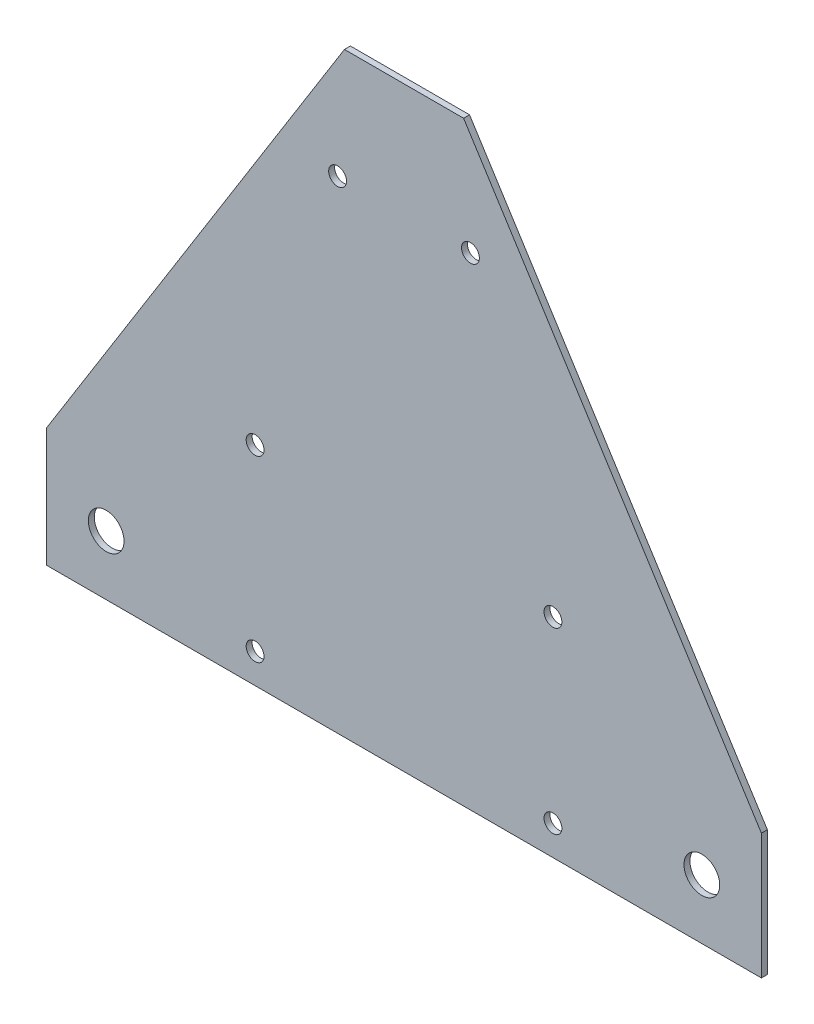
ISO-10303-21;
HEADER;
FILE_DESCRIPTION(('STEP AP214'),'2;1');
FILE_NAME('part.step','',(''),(''),'','','');
FILE_SCHEMA(('AUTOMOTIVE_DESIGN { 1 0 10303 214 1 1 1 1 }'));
ENDSEC;
DATA;
#1=APPLICATION_CONTEXT('core data for automotive mechanical design processes');
#2=APPLICATION_PROTOCOL_DEFINITION('international standard','automotive_design',2000,#1);
#3=PRODUCT_CONTEXT('',#1,'mechanical');
#4=PRODUCT('Part','Part','',(#3));
#5=PRODUCT_RELATED_PRODUCT_CATEGORY('part','',(#4));
#6=PRODUCT_DEFINITION_FORMATION('','',#4);
#7=PRODUCT_DEFINITION_CONTEXT('part definition',#1,'design');
#8=PRODUCT_DEFINITION('design','',#6,#7);
#9=PRODUCT_DEFINITION_SHAPE('','',#8);
#10=(LENGTH_UNIT() NAMED_UNIT(*) SI_UNIT(.MILLI.,.METRE.));
#11=(NAMED_UNIT(*) PLANE_ANGLE_UNIT() SI_UNIT($,.RADIAN.));
#12=(NAMED_UNIT(*) SI_UNIT($,.STERADIAN.) SOLID_ANGLE_UNIT());
#13=UNCERTAINTY_MEASURE_WITH_UNIT(LENGTH_MEASURE(1.E-05),#10,'distance_accuracy_value','');
#14=(GEOMETRIC_REPRESENTATION_CONTEXT(3) GLOBAL_UNCERTAINTY_ASSIGNED_CONTEXT((#13)) GLOBAL_UNIT_ASSIGNED_CONTEXT((#10,
#11,#12)) REPRESENTATION_CONTEXT('',''));
#15=CARTESIAN_POINT('',(0.,0.,0.));
#16=DIRECTION('',(0.,0.,1.));
#17=DIRECTION('',(1.,0.,0.));
#18=AXIS2_PLACEMENT_3D('',#15,#16,#17);
#19=CARTESIAN_POINT('',(29.7876692210684,18.86552384001,1.));
#20=DIRECTION('',(0.844819075554228,0.535052081184345,0.));
#21=DIRECTION('',(-0.535052081184345,0.844819075554228,0.));
#22=AXIS2_PLACEMENT_3D('',#19,#20,#21);
#23=PLANE('',#22);
#24=DIRECTION('',(0.535052081184345,-0.844819075554228,0.));
#25=VECTOR('',#24,1.);
#26=CARTESIAN_POINT('',(29.7876692210684,18.86552384001,0.));
#27=LINE('',#26,#25);
#28=CARTESIAN_POINT('',(10.,50.1092120838022,0.));
#29=VERTEX_POINT('',#28);
#30=CARTESIAN_POINT('',(60.,-28.8381563372504,0.));
#31=VERTEX_POINT('',#30);
#32=EDGE_CURVE('E160',#29,#31,#27,.T.);
#33=ORIENTED_EDGE('',*,*,#32,.F.);
#34=DIRECTION('',(0.,0.,-1.));
#35=VECTOR('',#34,1.);
#36=CARTESIAN_POINT('',(10.,50.1092120838022,1.));
#37=LINE('',#36,#35);
#38=CARTESIAN_POINT('',(10.,50.1092120838022,1.));
#39=VERTEX_POINT('',#38);
#40=EDGE_CURVE('E11',#39,#29,#37,.T.);
#41=ORIENTED_EDGE('',*,*,#40,.F.);
#42=DIRECTION('',(0.535052081184345,-0.844819075554228,0.));
#43=VECTOR('',#42,1.);
#44=CARTESIAN_POINT('',(29.7876692210684,18.86552384001,1.));
#45=LINE('',#44,#43);
#46=CARTESIAN_POINT('',(60.,-28.8381563372504,1.));
#47=VERTEX_POINT('',#46);
#48=EDGE_CURVE('E148',#39,#47,#45,.T.);
#49=ORIENTED_EDGE('',*,*,#48,.T.);
#50=DIRECTION('',(0.,0.,-1.));
#51=VECTOR('',#50,1.);
#52=CARTESIAN_POINT('',(60.,-28.8381563372504,1.));
#53=LINE('',#52,#51);
#54=EDGE_CURVE('E56',#47,#31,#53,.T.);
#55=ORIENTED_EDGE('',*,*,#54,.T.);
#56=EDGE_LOOP('',(#33,#41,#49,#55));
#57=FACE_BOUND('',#56,.T.);
#58=ADVANCED_FACE('F37',(#57),#23,.T.);
#59=CARTESIAN_POINT('',(0.,50.1092120838022,1.));
#60=DIRECTION('',(0.,1.,0.));
#61=DIRECTION('',(-1.,0.,0.));
#62=AXIS2_PLACEMENT_3D('',#59,#60,#61);
#63=PLANE('',#62);
#64=DIRECTION('',(1.,0.,0.));
#65=VECTOR('',#64,1.);
#66=CARTESIAN_POINT('',(0.,50.1092120838022,0.));
#67=LINE('',#66,#65);
#68=CARTESIAN_POINT('',(-10.,50.1092120838022,0.));
#69=VERTEX_POINT('',#68);
#70=EDGE_CURVE('E162',#69,#29,#67,.T.);
#71=ORIENTED_EDGE('',*,*,#70,.F.);
#72=DIRECTION('',(0.,0.,-1.));
#73=VECTOR('',#72,1.);
#74=CARTESIAN_POINT('',(-10.,50.1092120838022,1.));
#75=LINE('',#74,#73);
#76=CARTESIAN_POINT('',(-10.,50.1092120838022,1.));
#77=VERTEX_POINT('',#76);
#78=EDGE_CURVE('E47',#77,#69,#75,.T.);
#79=ORIENTED_EDGE('',*,*,#78,.F.);
#80=DIRECTION('',(1.,0.,0.));
#81=VECTOR('',#80,1.);
#82=CARTESIAN_POINT('',(0.,50.1092120838022,1.));
#83=LINE('',#82,#81);
#84=EDGE_CURVE('E150',#77,#39,#83,.T.);
#85=ORIENTED_EDGE('',*,*,#84,.T.);
#86=ORIENTED_EDGE('',*,*,#40,.T.);
#87=EDGE_LOOP('',(#71,#79,#85,#86));
#88=FACE_BOUND('',#87,.T.);
#89=ADVANCED_FACE('F188',(#88),#63,.T.);
#90=CARTESIAN_POINT('',(-29.7120054309224,18.5700033943265,1.));
#91=DIRECTION('',(0.847998304005088,-0.52999894000318,0.));
#92=DIRECTION('',(0.52999894000318,0.847998304005088,0.));
#93=AXIS2_PLACEMENT_3D('',#90,#91,#92);
#94=PLANE('',#93);
#95=DIRECTION('',(-0.52999894000318,-0.847998304005088,0.));
#96=VECTOR('',#95,1.);
#97=CARTESIAN_POINT('',(-29.7120054309224,18.5700033943265,0.));
#98=LINE('',#97,#96);
#99=CARTESIAN_POINT('',(-60.,-29.8907879161978,0.));
#100=VERTEX_POINT('',#99);
#101=EDGE_CURVE('E165',#69,#100,#98,.T.);
#102=ORIENTED_EDGE('',*,*,#101,.T.);
#103=DIRECTION('',(0.,0.,-1.));
#104=VECTOR('',#103,1.);
#105=CARTESIAN_POINT('',(-60.,-29.8907879161978,1.));
#106=LINE('',#105,#104);
#107=CARTESIAN_POINT('',(-60.,-29.8907879161978,1.));
#108=VERTEX_POINT('',#107);
#109=EDGE_CURVE('E116',#108,#100,#106,.T.);
#110=ORIENTED_EDGE('',*,*,#109,.F.);
#111=DIRECTION('',(-0.52999894000318,-0.847998304005088,0.));
#112=VECTOR('',#111,1.);
#113=CARTESIAN_POINT('',(-29.7120054309224,18.5700033943265,1.));
#114=LINE('',#113,#112);
#115=EDGE_CURVE('E109',#77,#108,#114,.T.);
#116=ORIENTED_EDGE('',*,*,#115,.F.);
#117=ORIENTED_EDGE('',*,*,#78,.T.);
#118=EDGE_LOOP('',(#102,#110,#116,#117));
#119=FACE_BOUND('',#118,.T.);
#120=ADVANCED_FACE('F193',(#119),#94,.F.);
#121=CARTESIAN_POINT('',(-60.,0.,1.));
#122=DIRECTION('',(1.,0.,0.));
#123=DIRECTION('',(0.,0.,-1.));
#124=AXIS2_PLACEMENT_3D('',#121,#122,#123);
#125=PLANE('',#124);
#126=DIRECTION('',(0.,-1.,0.));
#127=VECTOR('',#126,1.);
#128=CARTESIAN_POINT('',(-60.,0.,0.));
#129=LINE('',#128,#127);
#130=CARTESIAN_POINT('',(-60.,-49.8907879161978,0.));
#131=VERTEX_POINT('',#130);
#132=EDGE_CURVE('E115',#100,#131,#129,.T.);
#133=ORIENTED_EDGE('',*,*,#132,.T.);
#134=DIRECTION('',(0.,0.,-1.));
#135=VECTOR('',#134,1.);
#136=CARTESIAN_POINT('',(-60.,-49.8907879161978,1.));
#137=LINE('',#136,#135);
#138=CARTESIAN_POINT('',(-60.,-49.8907879161978,1.));
#139=VERTEX_POINT('',#138);
#140=EDGE_CURVE('E98',#139,#131,#137,.T.);
#141=ORIENTED_EDGE('',*,*,#140,.F.);
#142=DIRECTION('',(0.,-1.,0.));
#143=VECTOR('',#142,1.);
#144=CARTESIAN_POINT('',(-60.,0.,1.));
#145=LINE('',#144,#143);
#146=EDGE_CURVE('E103',#108,#139,#145,.T.);
#147=ORIENTED_EDGE('',*,*,#146,.F.);
#148=ORIENTED_EDGE('',*,*,#109,.T.);
#149=EDGE_LOOP('',(#133,#141,#147,#148));
#150=FACE_BOUND('',#149,.T.);
#151=ADVANCED_FACE('F114',(#150),#125,.F.);
#152=CARTESIAN_POINT('',(0.,-49.8907879161978,1.));
#153=DIRECTION('',(0.,1.,0.));
#154=DIRECTION('',(0.,0.,1.));
#155=AXIS2_PLACEMENT_3D('',#152,#153,#154);
#156=PLANE('',#155);
#157=DIRECTION('',(1.,0.,0.));
#158=VECTOR('',#157,1.);
#159=CARTESIAN_POINT('',(0.,-49.8907879161978,0.));
#160=LINE('',#159,#158);
#161=CARTESIAN_POINT('',(60.,-49.8907879161978,0.));
#162=VERTEX_POINT('',#161);
#163=EDGE_CURVE('E169',#131,#162,#160,.T.);
#164=ORIENTED_EDGE('',*,*,#163,.T.);
#165=DIRECTION('',(0.,0.,-1.));
#166=VECTOR('',#165,1.);
#167=CARTESIAN_POINT('',(60.,-49.8907879161978,1.));
#168=LINE('',#167,#166);
#169=CARTESIAN_POINT('',(60.,-49.8907879161978,1.));
#170=VERTEX_POINT('',#169);
#171=EDGE_CURVE('E76',#170,#162,#168,.T.);
#172=ORIENTED_EDGE('',*,*,#171,.F.);
#173=DIRECTION('',(1.,0.,0.));
#174=VECTOR('',#173,1.);
#175=CARTESIAN_POINT('',(0.,-49.8907879161978,1.));
#176=LINE('',#175,#174);
#177=EDGE_CURVE('E94',#139,#170,#176,.T.);
#178=ORIENTED_EDGE('',*,*,#177,.F.);
#179=ORIENTED_EDGE('',*,*,#140,.T.);
#180=EDGE_LOOP('',(#164,#172,#178,#179));
#181=FACE_BOUND('',#180,.T.);
#182=ADVANCED_FACE('F96',(#181),#156,.F.);
#183=CARTESIAN_POINT('',(-50.,-39.8907879161978,1.));
#184=DIRECTION('',(0.,0.,-1.));
#185=DIRECTION('',(-1.,0.,0.));
#186=AXIS2_PLACEMENT_3D('',#183,#184,#185);
#187=CYLINDRICAL_SURFACE('',#186,3.);
#188=CARTESIAN_POINT('',(-50.,-39.8907879161978,1.));
#189=DIRECTION('',(0.,0.,1.));
#190=DIRECTION('',(1.,0.,0.));
#191=AXIS2_PLACEMENT_3D('',#188,#189,#190);
#192=CIRCLE('',#191,3.);
#193=CARTESIAN_POINT('',(-47.,-39.8907879161978,1.));
#194=VERTEX_POINT('',#193);
#195=EDGE_CURVE('E144',#194,#194,#192,.T.);
#196=ORIENTED_EDGE('',*,*,#195,.T.);
#197=EDGE_LOOP('',(#196));
#198=FACE_BOUND('',#197,.T.);
#199=CARTESIAN_POINT('',(-50.,-39.8907879161978,0.));
#200=DIRECTION('',(0.,0.,1.));
#201=DIRECTION('',(1.,0.,0.));
#202=AXIS2_PLACEMENT_3D('',#199,#200,#201);
#203=CIRCLE('',#202,3.);
#204=CARTESIAN_POINT('',(-47.,-39.8907879161978,0.));
#205=VERTEX_POINT('',#204);
#206=EDGE_CURVE('E157',#205,#205,#203,.T.);
#207=ORIENTED_EDGE('',*,*,#206,.F.);
#208=EDGE_LOOP('',(#207));
#209=FACE_BOUND('',#208,.T.);
#210=ADVANCED_FACE('F183',(#198,#209),#187,.F.);
#211=CARTESIAN_POINT('',(50.,-39.8907879161978,1.));
#212=DIRECTION('',(0.,0.,-1.));
#213=DIRECTION('',(-1.,0.,0.));
#214=AXIS2_PLACEMENT_3D('',#211,#212,#213);
#215=CYLINDRICAL_SURFACE('',#214,3.);
#216=CARTESIAN_POINT('',(50.,-39.8907879161978,1.));
#217=DIRECTION('',(0.,0.,1.));
#218=DIRECTION('',(1.,0.,0.));
#219=AXIS2_PLACEMENT_3D('',#216,#217,#218);
#220=CIRCLE('',#219,3.);
#221=CARTESIAN_POINT('',(53.,-39.8907879161978,1.));
#222=VERTEX_POINT('',#221);
#223=EDGE_CURVE('E141',#222,#222,#220,.T.);
#224=ORIENTED_EDGE('',*,*,#223,.T.);
#225=EDGE_LOOP('',(#224));
#226=FACE_BOUND('',#225,.T.);
#227=CARTESIAN_POINT('',(50.,-39.8907879161978,0.));
#228=DIRECTION('',(0.,0.,1.));
#229=DIRECTION('',(1.,0.,0.));
#230=AXIS2_PLACEMENT_3D('',#227,#228,#229);
#231=CIRCLE('',#230,3.);
#232=CARTESIAN_POINT('',(53.,-39.8907879161978,0.));
#233=VERTEX_POINT('',#232);
#234=EDGE_CURVE('E128',#233,#233,#231,.T.);
#235=ORIENTED_EDGE('',*,*,#234,.F.);
#236=EDGE_LOOP('',(#235));
#237=FACE_BOUND('',#236,.T.);
#238=ADVANCED_FACE('F39',(#226,#237),#215,.F.);
#239=CARTESIAN_POINT('',(60.,0.,1.));
#240=DIRECTION('',(1.,0.,0.));
#241=DIRECTION('',(0.,1.,0.));
#242=AXIS2_PLACEMENT_3D('',#239,#240,#241);
#243=PLANE('',#242);
#244=DIRECTION('',(0.,-1.,0.));
#245=VECTOR('',#244,1.);
#246=CARTESIAN_POINT('',(60.,0.,0.));
#247=LINE('',#246,#245);
#248=EDGE_CURVE('E145',#31,#162,#247,.T.);
#249=ORIENTED_EDGE('',*,*,#248,.F.);
#250=ORIENTED_EDGE('',*,*,#54,.F.);
#251=DIRECTION('',(0.,-1.,0.));
#252=VECTOR('',#251,1.);
#253=CARTESIAN_POINT('',(60.,0.,1.));
#254=LINE('',#253,#252);
#255=EDGE_CURVE('E102',#47,#170,#254,.T.);
#256=ORIENTED_EDGE('',*,*,#255,.T.);
#257=ORIENTED_EDGE('',*,*,#171,.T.);
#258=EDGE_LOOP('',(#249,#250,#256,#257));
#259=FACE_BOUND('',#258,.T.);
#260=ADVANCED_FACE('F174',(#259),#243,.T.);
#261=CARTESIAN_POINT('',(0.,0.,1.));
#262=DIRECTION('',(0.,0.,1.));
#263=DIRECTION('',(1.,0.,0.));
#264=AXIS2_PLACEMENT_3D('',#261,#262,#263);
#265=PLANE('',#264);
#266=CARTESIAN_POINT('',(-25.,-14.8907879161978,1.));
#267=DIRECTION('',(0.,0.,1.));
#268=DIRECTION('',(-1.,0.,0.));
#269=AXIS2_PLACEMENT_3D('',#266,#267,#268);
#270=CIRCLE('',#269,1.50000000000001);
#271=CARTESIAN_POINT('',(-26.5,-14.8907879161978,1.));
#272=VERTEX_POINT('',#271);
#273=EDGE_CURVE('E256',#272,#272,#270,.T.);
#274=ORIENTED_EDGE('',*,*,#273,.F.);
#275=EDGE_LOOP('',(#274));
#276=FACE_BOUND('',#275,.T.);
#277=CARTESIAN_POINT('',(-25.,-44.8907879161978,1.));
#278=DIRECTION('',(0.,0.,1.));
#279=DIRECTION('',(-1.,0.,0.));
#280=AXIS2_PLACEMENT_3D('',#277,#278,#279);
#281=CIRCLE('',#280,1.50000000000001);
#282=CARTESIAN_POINT('',(-26.5,-44.8907879161978,1.));
#283=VERTEX_POINT('',#282);
#284=EDGE_CURVE('E249',#283,#283,#281,.T.);
#285=ORIENTED_EDGE('',*,*,#284,.F.);
#286=EDGE_LOOP('',(#285));
#287=FACE_BOUND('',#286,.T.);
#288=CARTESIAN_POINT('',(25.,-44.8907879161978,1.));
#289=DIRECTION('',(0.,0.,1.));
#290=DIRECTION('',(1.,0.,0.));
#291=AXIS2_PLACEMENT_3D('',#288,#289,#290);
#292=CIRCLE('',#291,1.5);
#293=CARTESIAN_POINT('',(26.5,-44.8907879161978,1.));
#294=VERTEX_POINT('',#293);
#295=EDGE_CURVE('E243',#294,#294,#292,.T.);
#296=ORIENTED_EDGE('',*,*,#295,.F.);
#297=EDGE_LOOP('',(#296));
#298=FACE_BOUND('',#297,.T.);
#299=CARTESIAN_POINT('',(25.,-14.8907879161978,1.));
#300=DIRECTION('',(0.,0.,1.));
#301=DIRECTION('',(1.,0.,0.));
#302=AXIS2_PLACEMENT_3D('',#299,#300,#301);
#303=CIRCLE('',#302,1.5);
#304=CARTESIAN_POINT('',(26.5,-14.8907879161978,1.));
#305=VERTEX_POINT('',#304);
#306=EDGE_CURVE('E138',#305,#305,#303,.T.);
#307=ORIENTED_EDGE('',*,*,#306,.F.);
#308=EDGE_LOOP('',(#307));
#309=FACE_BOUND('',#308,.T.);
#310=CARTESIAN_POINT('',(-11.15,31.1092120838022,1.));
#311=DIRECTION('',(0.,0.,1.));
#312=DIRECTION('',(1.,0.,0.));
#313=AXIS2_PLACEMENT_3D('',#310,#311,#312);
#314=CIRCLE('',#313,1.5);
#315=CARTESIAN_POINT('',(-9.65,31.1092120838022,1.));
#316=VERTEX_POINT('',#315);
#317=EDGE_CURVE('E124',#316,#316,#314,.T.);
#318=ORIENTED_EDGE('',*,*,#317,.F.);
#319=EDGE_LOOP('',(#318));
#320=FACE_BOUND('',#319,.T.);
#321=CARTESIAN_POINT('',(11.15,31.1092120838022,1.));
#322=DIRECTION('',(0.,0.,1.));
#323=DIRECTION('',(1.,0.,0.));
#324=AXIS2_PLACEMENT_3D('',#321,#322,#323);
#325=CIRCLE('',#324,1.5);
#326=CARTESIAN_POINT('',(12.65,31.1092120838022,1.));
#327=VERTEX_POINT('',#326);
#328=EDGE_CURVE('E130',#327,#327,#325,.T.);
#329=ORIENTED_EDGE('',*,*,#328,.F.);
#330=EDGE_LOOP('',(#329));
#331=FACE_BOUND('',#330,.T.);
#332=ORIENTED_EDGE('',*,*,#223,.F.);
#333=EDGE_LOOP('',(#332));
#334=FACE_BOUND('',#333,.T.);
#335=ORIENTED_EDGE('',*,*,#195,.F.);
#336=EDGE_LOOP('',(#335));
#337=FACE_BOUND('',#336,.T.);
#338=ORIENTED_EDGE('',*,*,#48,.F.);
#339=ORIENTED_EDGE('',*,*,#84,.F.);
#340=ORIENTED_EDGE('',*,*,#115,.T.);
#341=ORIENTED_EDGE('',*,*,#146,.T.);
#342=ORIENTED_EDGE('',*,*,#177,.T.);
#343=ORIENTED_EDGE('',*,*,#255,.F.);
#344=EDGE_LOOP('',(#338,#339,#340,#341,#342,#343));
#345=FACE_BOUND('',#344,.T.);
#346=ADVANCED_FACE('F106',(#276,#287,#298,#309,#320,#331,#334,#337,#345),#265,.T.);
#347=CARTESIAN_POINT('',(0.,0.,0.));
#348=DIRECTION('',(0.,0.,1.));
#349=DIRECTION('',(1.,0.,0.));
#350=AXIS2_PLACEMENT_3D('',#347,#348,#349);
#351=PLANE('',#350);
#352=CARTESIAN_POINT('',(-25.,-14.8907879161978,0.));
#353=DIRECTION('',(0.,0.,1.));
#354=DIRECTION('',(-1.,0.,0.));
#355=AXIS2_PLACEMENT_3D('',#352,#353,#354);
#356=CIRCLE('',#355,1.50000000000001);
#357=CARTESIAN_POINT('',(-26.5,-14.8907879161978,0.));
#358=VERTEX_POINT('',#357);
#359=EDGE_CURVE('E254',#358,#358,#356,.T.);
#360=ORIENTED_EDGE('',*,*,#359,.T.);
#361=EDGE_LOOP('',(#360));
#362=FACE_BOUND('',#361,.T.);
#363=CARTESIAN_POINT('',(-25.,-44.8907879161978,0.));
#364=DIRECTION('',(0.,0.,1.));
#365=DIRECTION('',(-1.,0.,0.));
#366=AXIS2_PLACEMENT_3D('',#363,#364,#365);
#367=CIRCLE('',#366,1.50000000000001);
#368=CARTESIAN_POINT('',(-26.5,-44.8907879161978,0.));
#369=VERTEX_POINT('',#368);
#370=EDGE_CURVE('E245',#369,#369,#367,.T.);
#371=ORIENTED_EDGE('',*,*,#370,.T.);
#372=EDGE_LOOP('',(#371));
#373=FACE_BOUND('',#372,.T.);
#374=CARTESIAN_POINT('',(25.,-44.8907879161978,0.));
#375=DIRECTION('',(0.,0.,1.));
#376=DIRECTION('',(1.,0.,0.));
#377=AXIS2_PLACEMENT_3D('',#374,#375,#376);
#378=CIRCLE('',#377,1.5);
#379=CARTESIAN_POINT('',(26.5,-44.8907879161978,0.));
#380=VERTEX_POINT('',#379);
#381=EDGE_CURVE('E240',#380,#380,#378,.T.);
#382=ORIENTED_EDGE('',*,*,#381,.T.);
#383=EDGE_LOOP('',(#382));
#384=FACE_BOUND('',#383,.T.);
#385=CARTESIAN_POINT('',(25.,-14.8907879161978,0.));
#386=DIRECTION('',(0.,0.,1.));
#387=DIRECTION('',(1.,0.,0.));
#388=AXIS2_PLACEMENT_3D('',#385,#386,#387);
#389=CIRCLE('',#388,1.5);
#390=CARTESIAN_POINT('',(26.5,-14.8907879161978,0.));
#391=VERTEX_POINT('',#390);
#392=EDGE_CURVE('E135',#391,#391,#389,.T.);
#393=ORIENTED_EDGE('',*,*,#392,.T.);
#394=EDGE_LOOP('',(#393));
#395=FACE_BOUND('',#394,.T.);
#396=CARTESIAN_POINT('',(-11.15,31.1092120838022,0.));
#397=DIRECTION('',(0.,0.,1.));
#398=DIRECTION('',(1.,0.,0.));
#399=AXIS2_PLACEMENT_3D('',#396,#397,#398);
#400=CIRCLE('',#399,1.5);
#401=CARTESIAN_POINT('',(-9.65,31.1092120838022,0.));
#402=VERTEX_POINT('',#401);
#403=EDGE_CURVE('E41',#402,#402,#400,.T.);
#404=ORIENTED_EDGE('',*,*,#403,.T.);
#405=EDGE_LOOP('',(#404));
#406=FACE_BOUND('',#405,.T.);
#407=CARTESIAN_POINT('',(11.15,31.1092120838022,0.));
#408=DIRECTION('',(0.,0.,1.));
#409=DIRECTION('',(1.,0.,0.));
#410=AXIS2_PLACEMENT_3D('',#407,#408,#409);
#411=CIRCLE('',#410,1.5);
#412=CARTESIAN_POINT('',(12.65,31.1092120838022,0.));
#413=VERTEX_POINT('',#412);
#414=EDGE_CURVE('E122',#413,#413,#411,.T.);
#415=ORIENTED_EDGE('',*,*,#414,.T.);
#416=EDGE_LOOP('',(#415));
#417=FACE_BOUND('',#416,.T.);
#418=ORIENTED_EDGE('',*,*,#234,.T.);
#419=EDGE_LOOP('',(#418));
#420=FACE_BOUND('',#419,.T.);
#421=ORIENTED_EDGE('',*,*,#206,.T.);
#422=EDGE_LOOP('',(#421));
#423=FACE_BOUND('',#422,.T.);
#424=ORIENTED_EDGE('',*,*,#32,.T.);
#425=ORIENTED_EDGE('',*,*,#248,.T.);
#426=ORIENTED_EDGE('',*,*,#163,.F.);
#427=ORIENTED_EDGE('',*,*,#132,.F.);
#428=ORIENTED_EDGE('',*,*,#101,.F.);
#429=ORIENTED_EDGE('',*,*,#70,.T.);
#430=EDGE_LOOP('',(#424,#425,#426,#427,#428,#429));
#431=FACE_BOUND('',#430,.T.);
#432=ADVANCED_FACE('F173',(#362,#373,#384,#395,#406,#417,#420,#423,#431),#351,.F.);
#433=CARTESIAN_POINT('',(11.15,31.1092120838022,-9.));
#434=DIRECTION('',(0.,0.,1.));
#435=DIRECTION('',(1.,0.,0.));
#436=AXIS2_PLACEMENT_3D('',#433,#434,#435);
#437=CYLINDRICAL_SURFACE('',#436,1.5);
#438=ORIENTED_EDGE('',*,*,#328,.T.);
#439=EDGE_LOOP('',(#438));
#440=FACE_BOUND('',#439,.T.);
#441=ORIENTED_EDGE('',*,*,#414,.F.);
#442=EDGE_LOOP('',(#441));
#443=FACE_BOUND('',#442,.T.);
#444=ADVANCED_FACE('F207',(#440,#443),#437,.F.);
#445=CARTESIAN_POINT('',(-11.15,31.1092120838022,-9.));
#446=DIRECTION('',(0.,0.,1.));
#447=DIRECTION('',(1.,0.,0.));
#448=AXIS2_PLACEMENT_3D('',#445,#446,#447);
#449=CYLINDRICAL_SURFACE('',#448,1.5);
#450=ORIENTED_EDGE('',*,*,#317,.T.);
#451=EDGE_LOOP('',(#450));
#452=FACE_BOUND('',#451,.T.);
#453=ORIENTED_EDGE('',*,*,#403,.F.);
#454=EDGE_LOOP('',(#453));
#455=FACE_BOUND('',#454,.T.);
#456=ADVANCED_FACE('F212',(#452,#455),#449,.F.);
#457=CARTESIAN_POINT('',(25.,-14.8907879161978,0.));
#458=DIRECTION('',(0.,0.,1.));
#459=DIRECTION('',(1.,0.,0.));
#460=AXIS2_PLACEMENT_3D('',#457,#458,#459);
#461=CYLINDRICAL_SURFACE('',#460,1.5);
#462=ORIENTED_EDGE('',*,*,#392,.F.);
#463=EDGE_LOOP('',(#462));
#464=FACE_BOUND('',#463,.T.);
#465=ORIENTED_EDGE('',*,*,#306,.T.);
#466=EDGE_LOOP('',(#465));
#467=FACE_BOUND('',#466,.T.);
#468=ADVANCED_FACE('F220',(#464,#467),#461,.F.);
#469=CARTESIAN_POINT('',(25.,-44.8907879161978,0.));
#470=DIRECTION('',(0.,0.,1.));
#471=DIRECTION('',(1.,0.,0.));
#472=AXIS2_PLACEMENT_3D('',#469,#470,#471);
#473=CYLINDRICAL_SURFACE('',#472,1.5);
#474=ORIENTED_EDGE('',*,*,#381,.F.);
#475=EDGE_LOOP('',(#474));
#476=FACE_BOUND('',#475,.T.);
#477=ORIENTED_EDGE('',*,*,#295,.T.);
#478=EDGE_LOOP('',(#477));
#479=FACE_BOUND('',#478,.T.);
#480=ADVANCED_FACE('F223',(#476,#479),#473,.F.);
#481=CARTESIAN_POINT('',(-25.,-44.8907879161978,0.));
#482=DIRECTION('',(0.,0.,1.));
#483=DIRECTION('',(1.,0.,0.));
#484=AXIS2_PLACEMENT_3D('',#481,#482,#483);
#485=CYLINDRICAL_SURFACE('',#484,1.50000000000001);
#486=ORIENTED_EDGE('',*,*,#370,.F.);
#487=EDGE_LOOP('',(#486));
#488=FACE_BOUND('',#487,.T.);
#489=ORIENTED_EDGE('',*,*,#284,.T.);
#490=EDGE_LOOP('',(#489));
#491=FACE_BOUND('',#490,.T.);
#492=ADVANCED_FACE('F228',(#488,#491),#485,.F.);
#493=CARTESIAN_POINT('',(-25.,-14.8907879161978,0.));
#494=DIRECTION('',(0.,0.,1.));
#495=DIRECTION('',(1.,0.,0.));
#496=AXIS2_PLACEMENT_3D('',#493,#494,#495);
#497=CYLINDRICAL_SURFACE('',#496,1.50000000000001);
#498=ORIENTED_EDGE('',*,*,#359,.F.);
#499=EDGE_LOOP('',(#498));
#500=FACE_BOUND('',#499,.T.);
#501=ORIENTED_EDGE('',*,*,#273,.T.);
#502=EDGE_LOOP('',(#501));
#503=FACE_BOUND('',#502,.T.);
#504=ADVANCED_FACE('F225',(#500,#503),#497,.F.);
#505=CLOSED_SHELL('',(#58,#89,#120,#151,#182,#210,#238,#260,#346,#432,#444,#456,#468,#480,#492,#504));
#506=MANIFOLD_SOLID_BREP('B2',#505);
#507=ADVANCED_BREP_SHAPE_REPRESENTATION('',(#18,#506),#14);
#508=SHAPE_DEFINITION_REPRESENTATION(#9,#507);
ENDSEC;
END-ISO-10303-21;
